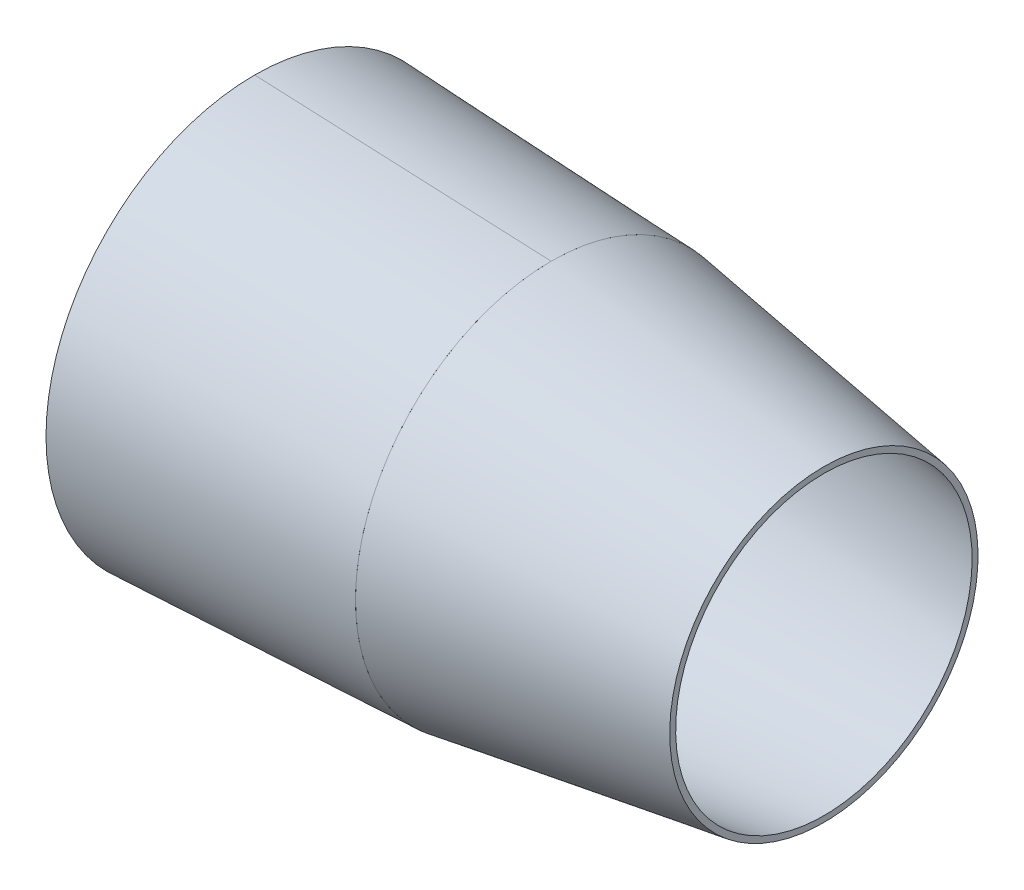
ISO-10303-21;
HEADER;
FILE_DESCRIPTION(('STEP AP214'),'2;1');
FILE_NAME('part.step','',(''),(''),'','','');
FILE_SCHEMA(('AUTOMOTIVE_DESIGN { 1 0 10303 214 1 1 1 1 }'));
ENDSEC;
DATA;
#1=APPLICATION_CONTEXT('core data for automotive mechanical design processes');
#2=APPLICATION_PROTOCOL_DEFINITION('international standard','automotive_design',2000,#1);
#3=PRODUCT_CONTEXT('',#1,'mechanical');
#4=PRODUCT('Part','Part','',(#3));
#5=PRODUCT_RELATED_PRODUCT_CATEGORY('part','',(#4));
#6=PRODUCT_DEFINITION_FORMATION('','',#4);
#7=PRODUCT_DEFINITION_CONTEXT('part definition',#1,'design');
#8=PRODUCT_DEFINITION('design','',#6,#7);
#9=PRODUCT_DEFINITION_SHAPE('','',#8);
#10=(LENGTH_UNIT() NAMED_UNIT(*) SI_UNIT(.MILLI.,.METRE.));
#11=(NAMED_UNIT(*) PLANE_ANGLE_UNIT() SI_UNIT($,.RADIAN.));
#12=(NAMED_UNIT(*) SI_UNIT($,.STERADIAN.) SOLID_ANGLE_UNIT());
#13=UNCERTAINTY_MEASURE_WITH_UNIT(LENGTH_MEASURE(1.E-05),#10,'distance_accuracy_value','');
#14=(GEOMETRIC_REPRESENTATION_CONTEXT(3) GLOBAL_UNCERTAINTY_ASSIGNED_CONTEXT((#13)) GLOBAL_UNIT_ASSIGNED_CONTEXT((#10,
#11,#12)) REPRESENTATION_CONTEXT('',''));
#15=CARTESIAN_POINT('',(0.,0.,0.));
#16=DIRECTION('',(0.,0.,1.));
#17=DIRECTION('',(1.,0.,0.));
#18=AXIS2_PLACEMENT_3D('',#15,#16,#17);
#19=CARTESIAN_POINT('',(3200.,0.,0.));
#20=DIRECTION('',(-1.,0.,0.));
#21=DIRECTION('',(0.,0.,1.));
#22=AXIS2_PLACEMENT_3D('',#19,#20,#21);
#23=CONICAL_SURFACE('',#22,1550.,0.129702537155912);
#24=CARTESIAN_POINT('',(3200.,0.,0.));
#25=DIRECTION('',(-1.,0.,0.));
#26=DIRECTION('',(0.,0.,1.));
#27=AXIS2_PLACEMENT_3D('',#24,#25,#26);
#28=CIRCLE('',#27,1550.);
#29=CARTESIAN_POINT('',(3200.,1550.,-1.1128358392509E-05));
#30=VERTEX_POINT('',#29);
#31=CARTESIAN_POINT('',(3200.,1550.,0.));
#32=VERTEX_POINT('',#31);
#33=EDGE_CURVE('E12',#30,#32,#28,.T.);
#34=ORIENTED_EDGE('',*,*,#33,.T.);
#35=DIRECTION('',(0.991600411186222,-0.129339184067768,0.));
#36=VECTOR('',#35,1.);
#37=CARTESIAN_POINT('',(5500.,1250.,0.));
#38=LINE('',#37,#36);
#39=CARTESIAN_POINT('',(5500.,1250.,0.));
#40=VERTEX_POINT('',#39);
#41=EDGE_CURVE('E108',#32,#40,#38,.T.);
#42=ORIENTED_EDGE('',*,*,#41,.T.);
#43=CARTESIAN_POINT('',(5500.,0.,0.));
#44=DIRECTION('',(-1.,0.,0.));
#45=DIRECTION('',(0.,0.,1.));
#46=AXIS2_PLACEMENT_3D('',#43,#44,#45);
#47=CIRCLE('',#46,1250.);
#48=CARTESIAN_POINT('',(5500.,1250.,-8.97448257460403E-06));
#49=VERTEX_POINT('',#48);
#50=EDGE_CURVE('E89',#49,#40,#47,.T.);
#51=ORIENTED_EDGE('',*,*,#50,.F.);
#52=DIRECTION('',(0.991600411186222,-0.129339184067768,9.2860180290375E-10));
#53=VECTOR('',#52,1.);
#54=CARTESIAN_POINT('',(5500.,1250.,-8.97448257460403E-06));
#55=LINE('',#54,#53);
#56=EDGE_CURVE('E117',#30,#49,#55,.T.);
#57=ORIENTED_EDGE('',*,*,#56,.F.);
#58=EDGE_LOOP('',(#34,#42,#51,#57));
#59=FACE_BOUND('',#58,.T.);
#60=ADVANCED_FACE('F49',(#59),#23,.F.);
#61=CARTESIAN_POINT('',(3200.,1550.,-1.1128358392509E-05));
#62=DIRECTION('',(1.,0.,0.));
#63=DIRECTION('',(0.,0.,-1.));
#64=AXIS2_PLACEMENT_3D('',#61,#62,#63);
#65=PLANE('',#64);
#66=CARTESIAN_POINT('',(3200.,0.,0.));
#67=DIRECTION('',(-1.,0.,0.));
#68=DIRECTION('',(0.,0.,1.));
#69=AXIS2_PLACEMENT_3D('',#66,#67,#68);
#70=CIRCLE('',#69,1650.);
#71=CARTESIAN_POINT('',(3200.,1650.,-1.18463169984773E-05));
#72=VERTEX_POINT('',#71);
#73=CARTESIAN_POINT('',(3200.,1650.,0.));
#74=VERTEX_POINT('',#73);
#75=EDGE_CURVE('E59',#72,#74,#70,.T.);
#76=ORIENTED_EDGE('',*,*,#75,.T.);
#77=DIRECTION('',(0.,-1.,0.));
#78=VECTOR('',#77,1.);
#79=CARTESIAN_POINT('',(3200.,1550.,0.));
#80=LINE('',#79,#78);
#81=EDGE_CURVE('E114',#74,#32,#80,.T.);
#82=ORIENTED_EDGE('',*,*,#81,.T.);
#83=ORIENTED_EDGE('',*,*,#33,.F.);
#84=DIRECTION('',(0.,-1.,7.17958605968322E-09));
#85=VECTOR('',#84,1.);
#86=CARTESIAN_POINT('',(3200.,1550.,-1.1128358392509E-05));
#87=LINE('',#86,#85);
#88=EDGE_CURVE('E105',#72,#30,#87,.T.);
#89=ORIENTED_EDGE('',*,*,#88,.F.);
#90=EDGE_LOOP('',(#76,#82,#83,#89));
#91=FACE_BOUND('',#90,.T.);
#92=ADVANCED_FACE('F55',(#91),#65,.F.);
#93=CARTESIAN_POINT('',(5500.,0.,0.));
#94=DIRECTION('',(-1.,0.,0.));
#95=DIRECTION('',(0.,0.,1.));
#96=AXIS2_PLACEMENT_3D('',#93,#94,#95);
#97=CONICAL_SURFACE('',#96,1300.,0.151015342921359);
#98=CARTESIAN_POINT('',(5500.,0.,0.));
#99=DIRECTION('',(-1.,0.,0.));
#100=DIRECTION('',(0.,0.,1.));
#101=AXIS2_PLACEMENT_3D('',#98,#99,#100);
#102=CIRCLE('',#101,1300.);
#103=CARTESIAN_POINT('',(5500.,1300.,-9.33346187758819E-06));
#104=VERTEX_POINT('',#103);
#105=CARTESIAN_POINT('',(5500.,1300.,0.));
#106=VERTEX_POINT('',#105);
#107=EDGE_CURVE('E102',#104,#106,#102,.T.);
#108=ORIENTED_EDGE('',*,*,#107,.T.);
#109=DIRECTION('',(-0.988618837339612,0.150441996986463,0.));
#110=VECTOR('',#109,1.);
#111=CARTESIAN_POINT('',(3200.,1650.,0.));
#112=LINE('',#111,#110);
#113=EDGE_CURVE('E109',#106,#74,#112,.T.);
#114=ORIENTED_EDGE('',*,*,#113,.T.);
#115=ORIENTED_EDGE('',*,*,#75,.F.);
#116=DIRECTION('',(-0.988618837339612,0.150441996986463,-1.08011126435491E-09));
#117=VECTOR('',#116,1.);
#118=CARTESIAN_POINT('',(3200.,1650.,-1.18463169984773E-05));
#119=LINE('',#118,#117);
#120=EDGE_CURVE('E119',#104,#72,#119,.T.);
#121=ORIENTED_EDGE('',*,*,#120,.F.);
#122=EDGE_LOOP('',(#108,#114,#115,#121));
#123=FACE_BOUND('',#122,.T.);
#124=ADVANCED_FACE('F122',(#123),#97,.T.);
#125=CARTESIAN_POINT('',(5500.,1300.,-9.33346187758819E-06));
#126=DIRECTION('',(-1.,0.,0.));
#127=DIRECTION('',(0.,0.,1.));
#128=AXIS2_PLACEMENT_3D('',#125,#126,#127);
#129=PLANE('',#128);
#130=DIRECTION('',(0.,1.,-7.17958605968322E-09));
#131=VECTOR('',#130,1.);
#132=CARTESIAN_POINT('',(5500.,1300.,-9.33346187758819E-06));
#133=LINE('',#132,#131);
#134=EDGE_CURVE('E96',#49,#104,#133,.T.);
#135=ORIENTED_EDGE('',*,*,#134,.F.);
#136=ORIENTED_EDGE('',*,*,#50,.T.);
#137=DIRECTION('',(0.,1.,0.));
#138=VECTOR('',#137,1.);
#139=CARTESIAN_POINT('',(5500.,1300.,0.));
#140=LINE('',#139,#138);
#141=EDGE_CURVE('E93',#40,#106,#140,.T.);
#142=ORIENTED_EDGE('',*,*,#141,.T.);
#143=ORIENTED_EDGE('',*,*,#107,.F.);
#144=EDGE_LOOP('',(#135,#136,#142,#143));
#145=FACE_BOUND('',#144,.T.);
#146=ADVANCED_FACE('F95',(#145),#129,.F.);
#147=CARTESIAN_POINT('',(0.,0.,0.));
#148=DIRECTION('',(0.,-7.17958605968322E-09,-1.));
#149=DIRECTION('',(-1.,0.,0.));
#150=AXIS2_PLACEMENT_3D('',#147,#148,#149);
#151=PLANE('',#150);
#152=ORIENTED_EDGE('',*,*,#56,.T.);
#153=ORIENTED_EDGE('',*,*,#134,.T.);
#154=ORIENTED_EDGE('',*,*,#120,.T.);
#155=ORIENTED_EDGE('',*,*,#88,.T.);
#156=EDGE_LOOP('',(#152,#153,#154,#155));
#157=FACE_BOUND('',#156,.T.);
#158=ADVANCED_FACE('F125',(#157),#151,.F.);
#159=CARTESIAN_POINT('',(0.,0.,0.));
#160=DIRECTION('',(0.,0.,-1.));
#161=DIRECTION('',(-1.,0.,0.));
#162=AXIS2_PLACEMENT_3D('',#159,#160,#161);
#163=PLANE('',#162);
#164=ORIENTED_EDGE('',*,*,#41,.F.);
#165=ORIENTED_EDGE('',*,*,#81,.F.);
#166=ORIENTED_EDGE('',*,*,#113,.F.);
#167=ORIENTED_EDGE('',*,*,#141,.F.);
#168=EDGE_LOOP('',(#164,#165,#166,#167));
#169=FACE_BOUND('',#168,.T.);
#170=ADVANCED_FACE('F107',(#169),#163,.T.);
#171=CLOSED_SHELL('',(#60,#92,#124,#146,#158,#170));
#172=MANIFOLD_SOLID_BREP('B2',#171);
#173=CARTESIAN_POINT('',(3200.,0.,0.));
#174=DIRECTION('',(-1.,0.,0.));
#175=DIRECTION('',(0.,0.,1.));
#176=AXIS2_PLACEMENT_3D('',#173,#174,#175);
#177=CONICAL_SURFACE('',#176,1610.,0.0439716382710345);
#178=CARTESIAN_POINT('',(700.,0.,0.));
#179=DIRECTION('',(-1.,0.,0.));
#180=DIRECTION('',(0.,0.,1.));
#181=AXIS2_PLACEMENT_3D('',#178,#179,#180);
#182=CIRCLE('',#181,1720.);
#183=CARTESIAN_POINT('',(700.,1719.99999999999,-9.21744442524983E-05));
#184=VERTEX_POINT('',#183);
#185=CARTESIAN_POINT('',(700.,-1720.,0.));
#186=VERTEX_POINT('',#185);
#187=EDGE_CURVE('E48',#184,#186,#182,.T.);
#188=ORIENTED_EDGE('',*,*,#187,.T.);
#189=DIRECTION('',(-0.999033403272237,-0.0439574697439774,0.));
#190=VECTOR('',#189,1.);
#191=CARTESIAN_POINT('',(3200.,-1610.,0.));
#192=LINE('',#191,#190);
#193=CARTESIAN_POINT('',(3200.,-1610.,0.));
#194=VERTEX_POINT('',#193);
#195=EDGE_CURVE('E211',#194,#186,#192,.T.);
#196=ORIENTED_EDGE('',*,*,#195,.F.);
#197=CARTESIAN_POINT('',(3200.,0.,0.));
#198=DIRECTION('',(-1.,0.,0.));
#199=DIRECTION('',(0.,0.,1.));
#200=AXIS2_PLACEMENT_3D('',#197,#198,#199);
#201=CIRCLE('',#200,1610.);
#202=CARTESIAN_POINT('',(3200.,1610.,-8.62795670037922E-05));
#203=VERTEX_POINT('',#202);
#204=EDGE_CURVE('E187',#203,#194,#201,.T.);
#205=ORIENTED_EDGE('',*,*,#204,.F.);
#206=DIRECTION('',(-0.999033403272237,0.0439574697439773,-2.3556717118588E-09));
#207=VECTOR('',#206,1.);
#208=CARTESIAN_POINT('',(3200.,1610.,-8.62795670037922E-05));
#209=LINE('',#208,#207);
#210=EDGE_CURVE('E214',#203,#184,#209,.T.);
#211=ORIENTED_EDGE('',*,*,#210,.T.);
#212=EDGE_LOOP('',(#188,#196,#205,#211));
#213=FACE_BOUND('',#212,.T.);
#214=ADVANCED_FACE('F171',(#213),#177,.F.);
#215=CARTESIAN_POINT('',(700.,1719.99999999999,-9.21744442524983E-05));
#216=DIRECTION('',(-1.,0.,0.));
#217=DIRECTION('',(0.,0.,1.));
#218=AXIS2_PLACEMENT_3D('',#215,#216,#217);
#219=PLANE('',#218);
#220=CARTESIAN_POINT('',(700.,0.,0.));
#221=DIRECTION('',(-1.,0.,0.));
#222=DIRECTION('',(0.,0.,1.));
#223=AXIS2_PLACEMENT_3D('',#220,#221,#222);
#224=CIRCLE('',#223,1760.);
#225=CARTESIAN_POINT('',(700.,1760.,-9.43180359793006E-05));
#226=VERTEX_POINT('',#225);
#227=CARTESIAN_POINT('',(700.,-1760.,0.));
#228=VERTEX_POINT('',#227);
#229=EDGE_CURVE('E181',#226,#228,#224,.T.);
#230=ORIENTED_EDGE('',*,*,#229,.T.);
#231=DIRECTION('',(0.,-1.,0.));
#232=VECTOR('',#231,1.);
#233=CARTESIAN_POINT('',(700.,-1720.,0.));
#234=LINE('',#233,#232);
#235=EDGE_CURVE('E222',#186,#228,#234,.T.);
#236=ORIENTED_EDGE('',*,*,#235,.F.);
#237=ORIENTED_EDGE('',*,*,#187,.F.);
#238=DIRECTION('',(0.,0.999999999999999,-5.35897931700572E-08));
#239=VECTOR('',#238,1.);
#240=CARTESIAN_POINT('',(700.,1719.99999999999,-9.21744442524983E-05));
#241=LINE('',#240,#239);
#242=EDGE_CURVE('E233',#184,#226,#241,.T.);
#243=ORIENTED_EDGE('',*,*,#242,.T.);
#244=EDGE_LOOP('',(#230,#236,#237,#243));
#245=FACE_BOUND('',#244,.T.);
#246=ADVANCED_FACE('F172',(#245),#219,.T.);
#247=CARTESIAN_POINT('',(700.,0.,0.));
#248=DIRECTION('',(-1.,0.,0.));
#249=DIRECTION('',(0.,0.,1.));
#250=AXIS2_PLACEMENT_3D('',#247,#248,#249);
#251=CONICAL_SURFACE('',#250,1760.,0.0439716382710348);
#252=CARTESIAN_POINT('',(3200.,0.,0.));
#253=DIRECTION('',(-1.,0.,0.));
#254=DIRECTION('',(0.,0.,1.));
#255=AXIS2_PLACEMENT_3D('',#252,#253,#254);
#256=CIRCLE('',#255,1650.);
#257=CARTESIAN_POINT('',(3200.,1650.,-8.84231587305945E-05));
#258=VERTEX_POINT('',#257);
#259=CARTESIAN_POINT('',(3200.,-1650.,0.));
#260=VERTEX_POINT('',#259);
#261=EDGE_CURVE('E197',#258,#260,#256,.T.);
#262=ORIENTED_EDGE('',*,*,#261,.T.);
#263=DIRECTION('',(0.999033403272237,0.0439574697439775,0.));
#264=VECTOR('',#263,1.);
#265=CARTESIAN_POINT('',(700.,-1760.,0.));
#266=LINE('',#265,#264);
#267=EDGE_CURVE('E228',#228,#260,#266,.T.);
#268=ORIENTED_EDGE('',*,*,#267,.F.);
#269=ORIENTED_EDGE('',*,*,#229,.F.);
#270=DIRECTION('',(0.999033403272237,-0.0439574697439774,2.3556717118588E-09));
#271=VECTOR('',#270,1.);
#272=CARTESIAN_POINT('',(700.,1760.,-9.43180359793006E-05));
#273=LINE('',#272,#271);
#274=EDGE_CURVE('E237',#226,#258,#273,.T.);
#275=ORIENTED_EDGE('',*,*,#274,.T.);
#276=EDGE_LOOP('',(#262,#268,#269,#275));
#277=FACE_BOUND('',#276,.T.);
#278=ADVANCED_FACE('F245',(#277),#251,.T.);
#279=CARTESIAN_POINT('',(3200.,1650.,-8.84231587305945E-05));
#280=DIRECTION('',(1.,0.,0.));
#281=DIRECTION('',(0.,0.,-1.));
#282=AXIS2_PLACEMENT_3D('',#279,#280,#281);
#283=PLANE('',#282);
#284=DIRECTION('',(0.,-0.999999999999999,5.35897931700572E-08));
#285=VECTOR('',#284,1.);
#286=CARTESIAN_POINT('',(3200.,1650.,-8.84231587305945E-05));
#287=LINE('',#286,#285);
#288=EDGE_CURVE('E239',#258,#203,#287,.T.);
#289=ORIENTED_EDGE('',*,*,#288,.T.);
#290=ORIENTED_EDGE('',*,*,#204,.T.);
#291=DIRECTION('',(0.,1.,0.));
#292=VECTOR('',#291,1.);
#293=CARTESIAN_POINT('',(3200.,-1650.,0.));
#294=LINE('',#293,#292);
#295=EDGE_CURVE('E226',#260,#194,#294,.T.);
#296=ORIENTED_EDGE('',*,*,#295,.F.);
#297=ORIENTED_EDGE('',*,*,#261,.F.);
#298=EDGE_LOOP('',(#289,#290,#296,#297));
#299=FACE_BOUND('',#298,.T.);
#300=ADVANCED_FACE('F241',(#299),#283,.T.);
#301=CARTESIAN_POINT('',(0.,0.,0.));
#302=DIRECTION('',(0.,-5.35897931700572E-08,-0.999999999999999));
#303=DIRECTION('',(1.,0.,0.));
#304=AXIS2_PLACEMENT_3D('',#301,#302,#303);
#305=PLANE('',#304);
#306=ORIENTED_EDGE('',*,*,#210,.F.);
#307=ORIENTED_EDGE('',*,*,#288,.F.);
#308=ORIENTED_EDGE('',*,*,#274,.F.);
#309=ORIENTED_EDGE('',*,*,#242,.F.);
#310=EDGE_LOOP('',(#306,#307,#308,#309));
#311=FACE_BOUND('',#310,.T.);
#312=ADVANCED_FACE('F250',(#311),#305,.F.);
#313=CARTESIAN_POINT('',(0.,0.,0.));
#314=DIRECTION('',(0.,0.,1.));
#315=DIRECTION('',(1.,0.,0.));
#316=AXIS2_PLACEMENT_3D('',#313,#314,#315);
#317=PLANE('',#316);
#318=ORIENTED_EDGE('',*,*,#195,.T.);
#319=ORIENTED_EDGE('',*,*,#235,.T.);
#320=ORIENTED_EDGE('',*,*,#267,.T.);
#321=ORIENTED_EDGE('',*,*,#295,.T.);
#322=EDGE_LOOP('',(#318,#319,#320,#321));
#323=FACE_BOUND('',#322,.T.);
#324=ADVANCED_FACE('F225',(#323),#317,.T.);
#325=CLOSED_SHELL('',(#214,#246,#278,#300,#312,#324));
#326=MANIFOLD_SOLID_BREP('B6',#325);
#327=CARTESIAN_POINT('',(700.,0.,0.));
#328=DIRECTION('',(-1.,0.,0.));
#329=DIRECTION('',(0.,0.,1.));
#330=AXIS2_PLACEMENT_3D('',#327,#328,#329);
#331=CONICAL_SURFACE('',#330,1720.,0.0439716382710355);
#332=CARTESIAN_POINT('',(700.,0.,0.));
#333=DIRECTION('',(-1.,0.,0.));
#334=DIRECTION('',(0.,0.,1.));
#335=AXIS2_PLACEMENT_3D('',#332,#333,#334);
#336=CIRCLE('',#335,1720.);
#337=CARTESIAN_POINT('',(700.,-1720.,9.21744442524985E-05));
#338=VERTEX_POINT('',#337);
#339=CARTESIAN_POINT('',(700.,1720.,0.));
#340=VERTEX_POINT('',#339);
#341=EDGE_CURVE('E173',#338,#340,#336,.T.);
#342=ORIENTED_EDGE('',*,*,#341,.T.);
#343=DIRECTION('',(0.999033403272237,-0.0439574697439784,0.));
#344=VECTOR('',#343,1.);
#345=CARTESIAN_POINT('',(3200.,1610.,0.));
#346=LINE('',#345,#344);
#347=CARTESIAN_POINT('',(3200.,1610.,0.));
#348=VERTEX_POINT('',#347);
#349=EDGE_CURVE('E352',#340,#348,#346,.T.);
#350=ORIENTED_EDGE('',*,*,#349,.T.);
#351=CARTESIAN_POINT('',(3200.,0.,0.));
#352=DIRECTION('',(-1.,0.,0.));
#353=DIRECTION('',(0.,0.,1.));
#354=AXIS2_PLACEMENT_3D('',#351,#352,#353);
#355=CIRCLE('',#354,1610.);
#356=CARTESIAN_POINT('',(3200.,-1610.,8.62795670037922E-05));
#357=VERTEX_POINT('',#356);
#358=EDGE_CURVE('E340',#357,#348,#355,.T.);
#359=ORIENTED_EDGE('',*,*,#358,.F.);
#360=DIRECTION('',(0.999033403272237,0.0439574697439783,-2.35567171185885E-09));
#361=VECTOR('',#360,1.);
#362=CARTESIAN_POINT('',(3200.,-1610.,8.62795670037922E-05));
#363=LINE('',#362,#361);
#364=EDGE_CURVE('E363',#338,#357,#363,.T.);
#365=ORIENTED_EDGE('',*,*,#364,.F.);
#366=EDGE_LOOP('',(#342,#350,#359,#365));
#367=FACE_BOUND('',#366,.T.);
#368=ADVANCED_FACE('F300',(#367),#331,.F.);
#369=CARTESIAN_POINT('',(700.,-1720.,9.21744442524985E-05));
#370=DIRECTION('',(1.,0.,0.));
#371=DIRECTION('',(0.,0.,-1.));
#372=AXIS2_PLACEMENT_3D('',#369,#370,#371);
#373=PLANE('',#372);
#374=CARTESIAN_POINT('',(700.,0.,0.));
#375=DIRECTION('',(-1.,0.,0.));
#376=DIRECTION('',(0.,0.,1.));
#377=AXIS2_PLACEMENT_3D('',#374,#375,#376);
#378=CIRCLE('',#377,1760.);
#379=CARTESIAN_POINT('',(700.,-1760.,9.43180359793007E-05));
#380=VERTEX_POINT('',#379);
#381=CARTESIAN_POINT('',(700.,1760.,0.));
#382=VERTEX_POINT('',#381);
#383=EDGE_CURVE('E304',#380,#382,#378,.T.);
#384=ORIENTED_EDGE('',*,*,#383,.T.);
#385=DIRECTION('',(0.,-1.,0.));
#386=VECTOR('',#385,1.);
#387=CARTESIAN_POINT('',(700.,1720.,0.));
#388=LINE('',#387,#386);
#389=EDGE_CURVE('E361',#382,#340,#388,.T.);
#390=ORIENTED_EDGE('',*,*,#389,.T.);
#391=ORIENTED_EDGE('',*,*,#341,.F.);
#392=DIRECTION('',(0.,0.999999999999999,-5.35897931700572E-08));
#393=VECTOR('',#392,1.);
#394=CARTESIAN_POINT('',(700.,-1720.,9.21744442524985E-05));
#395=LINE('',#394,#393);
#396=EDGE_CURVE('E350',#380,#338,#395,.T.);
#397=ORIENTED_EDGE('',*,*,#396,.F.);
#398=EDGE_LOOP('',(#384,#390,#391,#397));
#399=FACE_BOUND('',#398,.T.);
#400=ADVANCED_FACE('F299',(#399),#373,.F.);
#401=CARTESIAN_POINT('',(3200.,0.,0.));
#402=DIRECTION('',(-1.,0.,0.));
#403=DIRECTION('',(0.,0.,1.));
#404=AXIS2_PLACEMENT_3D('',#401,#402,#403);
#405=CONICAL_SURFACE('',#404,1650.,0.0439716382710356);
#406=CARTESIAN_POINT('',(3200.,0.,0.));
#407=DIRECTION('',(-1.,0.,0.));
#408=DIRECTION('',(0.,0.,1.));
#409=AXIS2_PLACEMENT_3D('',#406,#407,#408);
#410=CIRCLE('',#409,1650.);
#411=CARTESIAN_POINT('',(3200.,-1650.,8.84231587305945E-05));
#412=VERTEX_POINT('',#411);
#413=CARTESIAN_POINT('',(3200.,1650.,0.));
#414=VERTEX_POINT('',#413);
#415=EDGE_CURVE('E346',#412,#414,#410,.T.);
#416=ORIENTED_EDGE('',*,*,#415,.T.);
#417=DIRECTION('',(-0.999033403272237,0.0439574697439784,0.));
#418=VECTOR('',#417,1.);
#419=CARTESIAN_POINT('',(700.,1760.,0.));
#420=LINE('',#419,#418);
#421=EDGE_CURVE('E356',#414,#382,#420,.T.);
#422=ORIENTED_EDGE('',*,*,#421,.T.);
#423=ORIENTED_EDGE('',*,*,#383,.F.);
#424=DIRECTION('',(-0.999033403272237,-0.0439574697439784,2.35567171185885E-09));
#425=VECTOR('',#424,1.);
#426=CARTESIAN_POINT('',(700.,-1760.,9.43180359793007E-05));
#427=LINE('',#426,#425);
#428=EDGE_CURVE('E366',#412,#380,#427,.T.);
#429=ORIENTED_EDGE('',*,*,#428,.F.);
#430=EDGE_LOOP('',(#416,#422,#423,#429));
#431=FACE_BOUND('',#430,.T.);
#432=ADVANCED_FACE('F368',(#431),#405,.T.);
#433=CARTESIAN_POINT('',(3200.,-1650.,8.84231587305945E-05));
#434=DIRECTION('',(-1.,0.,0.));
#435=DIRECTION('',(0.,0.,1.));
#436=AXIS2_PLACEMENT_3D('',#433,#434,#435);
#437=PLANE('',#436);
#438=DIRECTION('',(0.,-0.999999999999999,5.35897931700572E-08));
#439=VECTOR('',#438,1.);
#440=CARTESIAN_POINT('',(3200.,-1650.,8.84231587305945E-05));
#441=LINE('',#440,#439);
#442=EDGE_CURVE('E343',#357,#412,#441,.T.);
#443=ORIENTED_EDGE('',*,*,#442,.F.);
#444=ORIENTED_EDGE('',*,*,#358,.T.);
#445=DIRECTION('',(0.,1.,0.));
#446=VECTOR('',#445,1.);
#447=CARTESIAN_POINT('',(3200.,1650.,0.));
#448=LINE('',#447,#446);
#449=EDGE_CURVE('E338',#348,#414,#448,.T.);
#450=ORIENTED_EDGE('',*,*,#449,.T.);
#451=ORIENTED_EDGE('',*,*,#415,.F.);
#452=EDGE_LOOP('',(#443,#444,#450,#451));
#453=FACE_BOUND('',#452,.T.);
#454=ADVANCED_FACE('F339',(#453),#437,.F.);
#455=CARTESIAN_POINT('',(0.,0.,0.));
#456=DIRECTION('',(0.,5.35897931700572E-08,0.999999999999999));
#457=DIRECTION('',(-1.,0.,0.));
#458=AXIS2_PLACEMENT_3D('',#455,#456,#457);
#459=PLANE('',#458);
#460=ORIENTED_EDGE('',*,*,#364,.T.);
#461=ORIENTED_EDGE('',*,*,#442,.T.);
#462=ORIENTED_EDGE('',*,*,#428,.T.);
#463=ORIENTED_EDGE('',*,*,#396,.T.);
#464=EDGE_LOOP('',(#460,#461,#462,#463));
#465=FACE_BOUND('',#464,.T.);
#466=ADVANCED_FACE('F372',(#465),#459,.F.);
#467=CARTESIAN_POINT('',(0.,0.,0.));
#468=DIRECTION('',(0.,0.,-1.));
#469=DIRECTION('',(-1.,0.,0.));
#470=AXIS2_PLACEMENT_3D('',#467,#468,#469);
#471=PLANE('',#470);
#472=ORIENTED_EDGE('',*,*,#349,.F.);
#473=ORIENTED_EDGE('',*,*,#389,.F.);
#474=ORIENTED_EDGE('',*,*,#421,.F.);
#475=ORIENTED_EDGE('',*,*,#449,.F.);
#476=EDGE_LOOP('',(#472,#473,#474,#475));
#477=FACE_BOUND('',#476,.T.);
#478=ADVANCED_FACE('F351',(#477),#471,.T.);
#479=CLOSED_SHELL('',(#368,#400,#432,#454,#466,#478));
#480=MANIFOLD_SOLID_BREP('B45',#479);
#481=ADVANCED_BREP_SHAPE_REPRESENTATION('',(#18,#172,#326,#480),#14);
#482=SHAPE_DEFINITION_REPRESENTATION(#9,#481);
ENDSEC;
END-ISO-10303-21;
